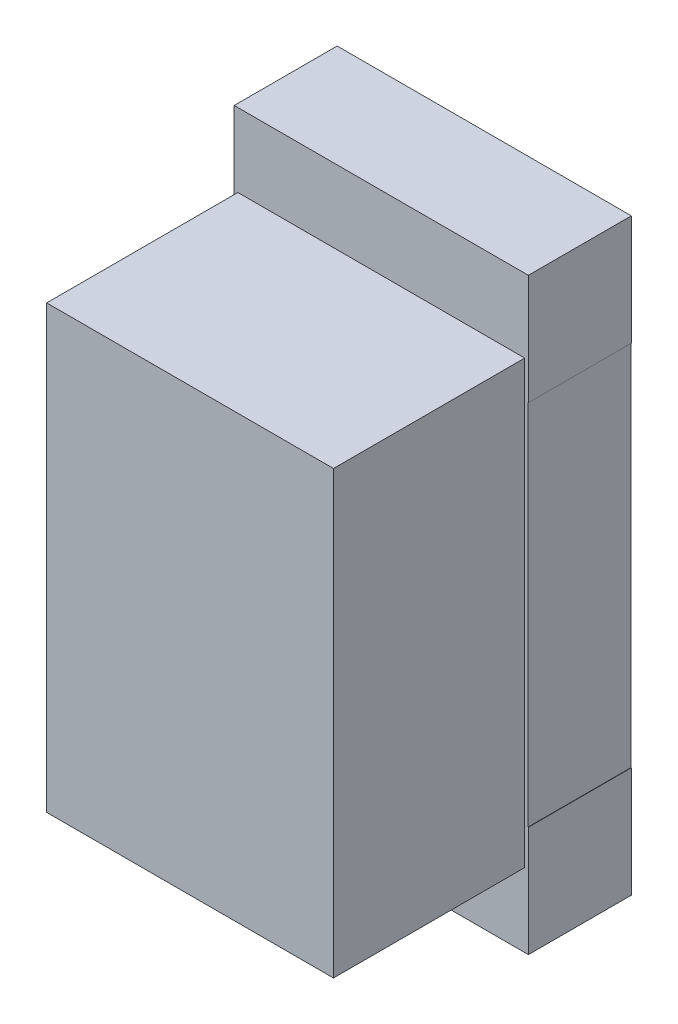
ISO-10303-21;
HEADER;
FILE_DESCRIPTION(('STEP AP214'),'2;1');
FILE_NAME('part.step','',(''),(''),'','','');
FILE_SCHEMA(('AUTOMOTIVE_DESIGN { 1 0 10303 214 1 1 1 1 }'));
ENDSEC;
DATA;
#1=APPLICATION_CONTEXT('core data for automotive mechanical design processes');
#2=APPLICATION_PROTOCOL_DEFINITION('international standard','automotive_design',2000,#1);
#3=PRODUCT_CONTEXT('',#1,'mechanical');
#4=PRODUCT('Part','Part','',(#3));
#5=PRODUCT_RELATED_PRODUCT_CATEGORY('part','',(#4));
#6=PRODUCT_DEFINITION_FORMATION('','',#4);
#7=PRODUCT_DEFINITION_CONTEXT('part definition',#1,'design');
#8=PRODUCT_DEFINITION('design','',#6,#7);
#9=PRODUCT_DEFINITION_SHAPE('','',#8);
#10=(LENGTH_UNIT() NAMED_UNIT(*) SI_UNIT(.MILLI.,.METRE.));
#11=(NAMED_UNIT(*) PLANE_ANGLE_UNIT() SI_UNIT($,.RADIAN.));
#12=(NAMED_UNIT(*) SI_UNIT($,.STERADIAN.) SOLID_ANGLE_UNIT());
#13=UNCERTAINTY_MEASURE_WITH_UNIT(LENGTH_MEASURE(1.E-05),#10,'distance_accuracy_value','');
#14=(GEOMETRIC_REPRESENTATION_CONTEXT(3) GLOBAL_UNCERTAINTY_ASSIGNED_CONTEXT((#13)) GLOBAL_UNIT_ASSIGNED_CONTEXT((#10,
#11,#12)) REPRESENTATION_CONTEXT('',''));
#15=CARTESIAN_POINT('',(0.,0.,0.));
#16=DIRECTION('',(0.,0.,1.));
#17=DIRECTION('',(1.,0.,0.));
#18=AXIS2_PLACEMENT_3D('',#15,#16,#17);
#19=CARTESIAN_POINT('',(0.399,-0.5,1.2800005));
#20=DIRECTION('',(0.,-1.,0.));
#21=DIRECTION('',(-1.,0.,0.));
#22=AXIS2_PLACEMENT_3D('',#19,#20,#21);
#23=PLANE('',#22);
#24=DIRECTION('',(0.,0.,-1.));
#25=VECTOR('',#24,1.);
#26=CARTESIAN_POINT('',(0.4,-0.5,1.2800005));
#27=LINE('',#26,#25);
#28=CARTESIAN_POINT('',(0.4,-0.5,0.28));
#29=VERTEX_POINT('',#28);
#30=CARTESIAN_POINT('',(0.4,-0.5,0.));
#31=VERTEX_POINT('',#30);
#32=EDGE_CURVE('E344',#29,#31,#27,.T.);
#33=ORIENTED_EDGE('',*,*,#32,.T.);
#34=DIRECTION('',(-1.,0.,0.));
#35=VECTOR('',#34,1.);
#36=CARTESIAN_POINT('',(0.399,-0.5,0.));
#37=LINE('',#36,#35);
#38=CARTESIAN_POINT('',(0.399,-0.5,0.));
#39=VERTEX_POINT('',#38);
#40=EDGE_CURVE('E249',#31,#39,#37,.T.);
#41=ORIENTED_EDGE('',*,*,#40,.T.);
#42=DIRECTION('',(0.,0.,-1.));
#43=VECTOR('',#42,1.);
#44=CARTESIAN_POINT('',(0.399,-0.5,1.2800005));
#45=LINE('',#44,#43);
#46=CARTESIAN_POINT('',(0.399,-0.5,0.28));
#47=VERTEX_POINT('',#46);
#48=EDGE_CURVE('E27',#47,#39,#45,.T.);
#49=ORIENTED_EDGE('',*,*,#48,.F.);
#50=DIRECTION('',(-1.,0.,0.));
#51=VECTOR('',#50,1.);
#52=CARTESIAN_POINT('',(0.399,-0.5,0.28));
#53=LINE('',#52,#51);
#54=EDGE_CURVE('E208',#29,#47,#53,.T.);
#55=ORIENTED_EDGE('',*,*,#54,.F.);
#56=EDGE_LOOP('',(#33,#41,#49,#55));
#57=FACE_BOUND('',#56,.T.);
#58=ADVANCED_FACE('F16',(#57),#23,.F.);
#59=CARTESIAN_POINT('',(0.399,0.5,1.2800005));
#60=DIRECTION('',(4.33987020582556E-13,1.,0.));
#61=DIRECTION('',(1.,-4.33987020582556E-13,0.));
#62=AXIS2_PLACEMENT_3D('',#59,#60,#61);
#63=PLANE('',#62);
#64=DIRECTION('',(0.,0.,-1.));
#65=VECTOR('',#64,1.);
#66=CARTESIAN_POINT('',(0.399,0.5,1.2800005));
#67=LINE('',#66,#65);
#68=CARTESIAN_POINT('',(0.399,0.5,0.28));
#69=VERTEX_POINT('',#68);
#70=CARTESIAN_POINT('',(0.399,0.5,0.));
#71=VERTEX_POINT('',#70);
#72=EDGE_CURVE('E11',#69,#71,#67,.T.);
#73=ORIENTED_EDGE('',*,*,#72,.T.);
#74=DIRECTION('',(1.,-4.33987020582556E-13,0.));
#75=VECTOR('',#74,1.);
#76=CARTESIAN_POINT('',(0.399,0.5,0.));
#77=LINE('',#76,#75);
#78=CARTESIAN_POINT('',(0.4,0.5,0.));
#79=VERTEX_POINT('',#78);
#80=EDGE_CURVE('E275',#71,#79,#77,.T.);
#81=ORIENTED_EDGE('',*,*,#80,.T.);
#82=DIRECTION('',(0.,0.,-1.));
#83=VECTOR('',#82,1.);
#84=CARTESIAN_POINT('',(0.4,0.5,1.2800005));
#85=LINE('',#84,#83);
#86=CARTESIAN_POINT('',(0.4,0.5,0.28));
#87=VERTEX_POINT('',#86);
#88=EDGE_CURVE('E218',#87,#79,#85,.T.);
#89=ORIENTED_EDGE('',*,*,#88,.F.);
#90=DIRECTION('',(1.,-4.33987020582556E-13,0.));
#91=VECTOR('',#90,1.);
#92=CARTESIAN_POINT('',(0.399,0.5,0.28));
#93=LINE('',#92,#91);
#94=EDGE_CURVE('E410',#69,#87,#93,.T.);
#95=ORIENTED_EDGE('',*,*,#94,.F.);
#96=EDGE_LOOP('',(#73,#81,#89,#95));
#97=FACE_BOUND('',#96,.T.);
#98=ADVANCED_FACE('F409',(#97),#63,.F.);
#99=CARTESIAN_POINT('',(0.399,0.5,1.2800005));
#100=DIRECTION('',(-1.,0.,0.));
#101=DIRECTION('',(0.,0.,1.));
#102=AXIS2_PLACEMENT_3D('',#99,#100,#101);
#103=PLANE('',#102);
#104=ORIENTED_EDGE('',*,*,#48,.T.);
#105=DIRECTION('',(0.,1.,0.));
#106=VECTOR('',#105,1.);
#107=CARTESIAN_POINT('',(0.399,0.5,0.));
#108=LINE('',#107,#106);
#109=CARTESIAN_POINT('',(0.399,0.,0.));
#110=VERTEX_POINT('',#109);
#111=EDGE_CURVE('E212',#39,#110,#108,.T.);
#112=ORIENTED_EDGE('',*,*,#111,.T.);
#113=DIRECTION('',(0.,1.,0.));
#114=VECTOR('',#113,1.);
#115=CARTESIAN_POINT('',(0.399,0.5,0.));
#116=LINE('',#115,#114);
#117=CARTESIAN_POINT('',(0.399,0.266,0.));
#118=VERTEX_POINT('',#117);
#119=EDGE_CURVE('E432',#110,#118,#116,.T.);
#120=ORIENTED_EDGE('',*,*,#119,.T.);
#121=DIRECTION('',(0.,1.,0.));
#122=VECTOR('',#121,1.);
#123=CARTESIAN_POINT('',(0.399,0.5,0.));
#124=LINE('',#123,#122);
#125=EDGE_CURVE('E303',#118,#71,#124,.T.);
#126=ORIENTED_EDGE('',*,*,#125,.T.);
#127=ORIENTED_EDGE('',*,*,#72,.F.);
#128=DIRECTION('',(0.,1.,0.));
#129=VECTOR('',#128,1.);
#130=CARTESIAN_POINT('',(0.399,0.5,0.28));
#131=LINE('',#130,#129);
#132=EDGE_CURVE('E201',#47,#69,#131,.T.);
#133=ORIENTED_EDGE('',*,*,#132,.F.);
#134=EDGE_LOOP('',(#104,#112,#120,#126,#127,#133));
#135=FACE_BOUND('',#134,.T.);
#136=ADVANCED_FACE('F413',(#135),#103,.F.);
#137=CARTESIAN_POINT('',(-0.4,-0.5,1.2800005));
#138=DIRECTION('',(0.,-1.,0.));
#139=DIRECTION('',(-1.,0.,0.));
#140=AXIS2_PLACEMENT_3D('',#137,#138,#139);
#141=PLANE('',#140);
#142=DIRECTION('',(0.,0.,-1.));
#143=VECTOR('',#142,1.);
#144=CARTESIAN_POINT('',(-0.399,-0.5,1.2800005));
#145=LINE('',#144,#143);
#146=CARTESIAN_POINT('',(-0.399,-0.5,0.28));
#147=VERTEX_POINT('',#146);
#148=CARTESIAN_POINT('',(-0.399,-0.5,0.));
#149=VERTEX_POINT('',#148);
#150=EDGE_CURVE('E230',#147,#149,#145,.T.);
#151=ORIENTED_EDGE('',*,*,#150,.T.);
#152=DIRECTION('',(-1.,0.,0.));
#153=VECTOR('',#152,1.);
#154=CARTESIAN_POINT('',(-0.4,-0.5,0.));
#155=LINE('',#154,#153);
#156=CARTESIAN_POINT('',(-0.4,-0.5,0.));
#157=VERTEX_POINT('',#156);
#158=EDGE_CURVE('E290',#149,#157,#155,.T.);
#159=ORIENTED_EDGE('',*,*,#158,.T.);
#160=DIRECTION('',(0.,0.,-1.));
#161=VECTOR('',#160,1.);
#162=CARTESIAN_POINT('',(-0.4,-0.5,1.2800005));
#163=LINE('',#162,#161);
#164=CARTESIAN_POINT('',(-0.4,-0.5,0.28));
#165=VERTEX_POINT('',#164);
#166=EDGE_CURVE('E254',#165,#157,#163,.T.);
#167=ORIENTED_EDGE('',*,*,#166,.F.);
#168=DIRECTION('',(-1.,0.,0.));
#169=VECTOR('',#168,1.);
#170=CARTESIAN_POINT('',(-0.4,-0.5,0.28));
#171=LINE('',#170,#169);
#172=EDGE_CURVE('E348',#147,#165,#171,.T.);
#173=ORIENTED_EDGE('',*,*,#172,.F.);
#174=EDGE_LOOP('',(#151,#159,#167,#173));
#175=FACE_BOUND('',#174,.T.);
#176=ADVANCED_FACE('F606',(#175),#141,.F.);
#177=CARTESIAN_POINT('',(-0.399,0.5,1.2800005));
#178=DIRECTION('',(1.,0.,0.));
#179=DIRECTION('',(0.,-1.,0.));
#180=AXIS2_PLACEMENT_3D('',#177,#178,#179);
#181=PLANE('',#180);
#182=DIRECTION('',(0.,0.,-1.));
#183=VECTOR('',#182,1.);
#184=CARTESIAN_POINT('',(-0.399,0.5,1.2800005));
#185=LINE('',#184,#183);
#186=CARTESIAN_POINT('',(-0.399,0.5,0.28));
#187=VERTEX_POINT('',#186);
#188=CARTESIAN_POINT('',(-0.399,0.5,0.));
#189=VERTEX_POINT('',#188);
#190=EDGE_CURVE('E234',#187,#189,#185,.T.);
#191=ORIENTED_EDGE('',*,*,#190,.T.);
#192=DIRECTION('',(0.,-1.,0.));
#193=VECTOR('',#192,1.);
#194=CARTESIAN_POINT('',(-0.399,0.5,0.));
#195=LINE('',#194,#193);
#196=CARTESIAN_POINT('',(-0.399,0.266,0.));
#197=VERTEX_POINT('',#196);
#198=EDGE_CURVE('E279',#189,#197,#195,.T.);
#199=ORIENTED_EDGE('',*,*,#198,.T.);
#200=DIRECTION('',(0.,-1.,0.));
#201=VECTOR('',#200,1.);
#202=CARTESIAN_POINT('',(-0.399,0.5,0.));
#203=LINE('',#202,#201);
#204=CARTESIAN_POINT('',(-0.399,0.,0.));
#205=VERTEX_POINT('',#204);
#206=EDGE_CURVE('E343',#197,#205,#203,.T.);
#207=ORIENTED_EDGE('',*,*,#206,.T.);
#208=DIRECTION('',(0.,-1.,0.));
#209=VECTOR('',#208,1.);
#210=CARTESIAN_POINT('',(-0.399,0.5,0.));
#211=LINE('',#210,#209);
#212=EDGE_CURVE('E243',#205,#149,#211,.T.);
#213=ORIENTED_EDGE('',*,*,#212,.T.);
#214=ORIENTED_EDGE('',*,*,#150,.F.);
#215=DIRECTION('',(0.,-1.,0.));
#216=VECTOR('',#215,1.);
#217=CARTESIAN_POINT('',(-0.399,0.5,0.28));
#218=LINE('',#217,#216);
#219=EDGE_CURVE('E436',#187,#147,#218,.T.);
#220=ORIENTED_EDGE('',*,*,#219,.F.);
#221=EDGE_LOOP('',(#191,#199,#207,#213,#214,#220));
#222=FACE_BOUND('',#221,.T.);
#223=ADVANCED_FACE('F370',(#222),#181,.F.);
#224=CARTESIAN_POINT('',(-0.4,0.5,1.2800005));
#225=DIRECTION('',(0.,1.,0.));
#226=DIRECTION('',(1.,0.,0.));
#227=AXIS2_PLACEMENT_3D('',#224,#225,#226);
#228=PLANE('',#227);
#229=DIRECTION('',(0.,0.,-1.));
#230=VECTOR('',#229,1.);
#231=CARTESIAN_POINT('',(-0.4,0.5,1.2800005));
#232=LINE('',#231,#230);
#233=CARTESIAN_POINT('',(-0.4,0.5,0.28));
#234=VERTEX_POINT('',#233);
#235=CARTESIAN_POINT('',(-0.4,0.5,0.));
#236=VERTEX_POINT('',#235);
#237=EDGE_CURVE('E225',#234,#236,#232,.T.);
#238=ORIENTED_EDGE('',*,*,#237,.T.);
#239=DIRECTION('',(1.,0.,0.));
#240=VECTOR('',#239,1.);
#241=CARTESIAN_POINT('',(-0.4,0.5,0.));
#242=LINE('',#241,#240);
#243=EDGE_CURVE('E278',#236,#189,#242,.T.);
#244=ORIENTED_EDGE('',*,*,#243,.T.);
#245=ORIENTED_EDGE('',*,*,#190,.F.);
#246=DIRECTION('',(1.,0.,0.));
#247=VECTOR('',#246,1.);
#248=CARTESIAN_POINT('',(-0.4,0.5,0.28));
#249=LINE('',#248,#247);
#250=EDGE_CURVE('E433',#234,#187,#249,.T.);
#251=ORIENTED_EDGE('',*,*,#250,.F.);
#252=EDGE_LOOP('',(#238,#244,#245,#251));
#253=FACE_BOUND('',#252,.T.);
#254=ADVANCED_FACE('F748',(#253),#228,.F.);
#255=CARTESIAN_POINT('',(0.,0.,0.8));
#256=DIRECTION('',(0.,0.,1.));
#257=DIRECTION('',(1.,0.,0.));
#258=AXIS2_PLACEMENT_3D('',#255,#256,#257);
#259=PLANE('',#258);
#260=DIRECTION('',(0.,-1.,0.));
#261=VECTOR('',#260,1.);
#262=CARTESIAN_POINT('',(-0.39,0.6,0.8));
#263=LINE('',#262,#261);
#264=CARTESIAN_POINT('',(-0.39,0.6,0.8));
#265=VERTEX_POINT('',#264);
#266=CARTESIAN_POINT('',(-0.39,-0.6,0.8));
#267=VERTEX_POINT('',#266);
#268=EDGE_CURVE('E183',#265,#267,#263,.T.);
#269=ORIENTED_EDGE('',*,*,#268,.T.);
#270=DIRECTION('',(1.,0.,0.));
#271=VECTOR('',#270,1.);
#272=CARTESIAN_POINT('',(0.39,-0.6,0.8));
#273=LINE('',#272,#271);
#274=CARTESIAN_POINT('',(0.39,-0.6,0.8));
#275=VERTEX_POINT('',#274);
#276=EDGE_CURVE('E116',#267,#275,#273,.T.);
#277=ORIENTED_EDGE('',*,*,#276,.T.);
#278=DIRECTION('',(0.,1.,0.));
#279=VECTOR('',#278,1.);
#280=CARTESIAN_POINT('',(0.39,-0.6,0.8));
#281=LINE('',#280,#279);
#282=CARTESIAN_POINT('',(0.39,0.6,0.8));
#283=VERTEX_POINT('',#282);
#284=EDGE_CURVE('E235',#275,#283,#281,.T.);
#285=ORIENTED_EDGE('',*,*,#284,.T.);
#286=DIRECTION('',(-1.,0.,0.));
#287=VECTOR('',#286,1.);
#288=CARTESIAN_POINT('',(-0.39,0.6,0.8));
#289=LINE('',#288,#287);
#290=EDGE_CURVE('E20',#283,#265,#289,.T.);
#291=ORIENTED_EDGE('',*,*,#290,.T.);
#292=EDGE_LOOP('',(#269,#277,#285,#291));
#293=FACE_BOUND('',#292,.T.);
#294=ADVANCED_FACE('F753',(#293),#259,.T.);
#295=CARTESIAN_POINT('',(-0.39,0.6,0.8));
#296=DIRECTION('',(0.,-1.,0.));
#297=DIRECTION('',(-1.,0.,0.));
#298=AXIS2_PLACEMENT_3D('',#295,#296,#297);
#299=PLANE('',#298);
#300=DIRECTION('',(-1.,0.,0.));
#301=VECTOR('',#300,1.);
#302=CARTESIAN_POINT('',(-0.39,0.6,0.28));
#303=LINE('',#302,#301);
#304=CARTESIAN_POINT('',(0.39,0.6,0.28));
#305=VERTEX_POINT('',#304);
#306=CARTESIAN_POINT('',(-0.39,0.6,0.28));
#307=VERTEX_POINT('',#306);
#308=EDGE_CURVE('E187',#305,#307,#303,.T.);
#309=ORIENTED_EDGE('',*,*,#308,.T.);
#310=DIRECTION('',(0.,0.,-1.));
#311=VECTOR('',#310,1.);
#312=CARTESIAN_POINT('',(-0.39,0.6,0.8));
#313=LINE('',#312,#311);
#314=EDGE_CURVE('E177',#265,#307,#313,.T.);
#315=ORIENTED_EDGE('',*,*,#314,.F.);
#316=ORIENTED_EDGE('',*,*,#290,.F.);
#317=DIRECTION('',(0.,0.,-1.));
#318=VECTOR('',#317,1.);
#319=CARTESIAN_POINT('',(0.39,0.6,0.8));
#320=LINE('',#319,#318);
#321=EDGE_CURVE('E190',#283,#305,#320,.T.);
#322=ORIENTED_EDGE('',*,*,#321,.T.);
#323=EDGE_LOOP('',(#309,#315,#316,#322));
#324=FACE_BOUND('',#323,.T.);
#325=ADVANCED_FACE('F188',(#324),#299,.F.);
#326=CARTESIAN_POINT('',(0.39,-0.6,0.8));
#327=DIRECTION('',(-1.,0.,0.));
#328=DIRECTION('',(0.,0.,1.));
#329=AXIS2_PLACEMENT_3D('',#326,#327,#328);
#330=PLANE('',#329);
#331=DIRECTION('',(0.,1.,0.));
#332=VECTOR('',#331,1.);
#333=CARTESIAN_POINT('',(0.39,-0.6,0.28));
#334=LINE('',#333,#332);
#335=CARTESIAN_POINT('',(0.39,-0.6,0.28));
#336=VERTEX_POINT('',#335);
#337=EDGE_CURVE('E194',#336,#305,#334,.T.);
#338=ORIENTED_EDGE('',*,*,#337,.T.);
#339=ORIENTED_EDGE('',*,*,#321,.F.);
#340=ORIENTED_EDGE('',*,*,#284,.F.);
#341=DIRECTION('',(0.,0.,-1.));
#342=VECTOR('',#341,1.);
#343=CARTESIAN_POINT('',(0.39,-0.6,0.8));
#344=LINE('',#343,#342);
#345=EDGE_CURVE('E126',#275,#336,#344,.T.);
#346=ORIENTED_EDGE('',*,*,#345,.T.);
#347=EDGE_LOOP('',(#338,#339,#340,#346));
#348=FACE_BOUND('',#347,.T.);
#349=ADVANCED_FACE('F18',(#348),#330,.F.);
#350=CARTESIAN_POINT('',(0.39,-0.6,0.8));
#351=DIRECTION('',(0.,1.,0.));
#352=DIRECTION('',(1.,0.,0.));
#353=AXIS2_PLACEMENT_3D('',#350,#351,#352);
#354=PLANE('',#353);
#355=DIRECTION('',(1.,0.,0.));
#356=VECTOR('',#355,1.);
#357=CARTESIAN_POINT('',(0.39,-0.6,0.28));
#358=LINE('',#357,#356);
#359=CARTESIAN_POINT('',(-0.39,-0.6,0.28));
#360=VERTEX_POINT('',#359);
#361=EDGE_CURVE('E199',#360,#336,#358,.T.);
#362=ORIENTED_EDGE('',*,*,#361,.T.);
#363=ORIENTED_EDGE('',*,*,#345,.F.);
#364=ORIENTED_EDGE('',*,*,#276,.F.);
#365=DIRECTION('',(0.,0.,-1.));
#366=VECTOR('',#365,1.);
#367=CARTESIAN_POINT('',(-0.39,-0.6,0.8));
#368=LINE('',#367,#366);
#369=EDGE_CURVE('E262',#267,#360,#368,.T.);
#370=ORIENTED_EDGE('',*,*,#369,.T.);
#371=EDGE_LOOP('',(#362,#363,#364,#370));
#372=FACE_BOUND('',#371,.T.);
#373=ADVANCED_FACE('F629',(#372),#354,.F.);
#374=CARTESIAN_POINT('',(-0.39,0.6,0.8));
#375=DIRECTION('',(1.,0.,0.));
#376=DIRECTION('',(0.,0.,1.));
#377=AXIS2_PLACEMENT_3D('',#374,#375,#376);
#378=PLANE('',#377);
#379=DIRECTION('',(0.,-1.,0.));
#380=VECTOR('',#379,1.);
#381=CARTESIAN_POINT('',(-0.39,0.6,0.28));
#382=LINE('',#381,#380);
#383=EDGE_CURVE('E182',#307,#360,#382,.T.);
#384=ORIENTED_EDGE('',*,*,#383,.T.);
#385=ORIENTED_EDGE('',*,*,#369,.F.);
#386=ORIENTED_EDGE('',*,*,#268,.F.);
#387=ORIENTED_EDGE('',*,*,#314,.T.);
#388=EDGE_LOOP('',(#384,#385,#386,#387));
#389=FACE_BOUND('',#388,.T.);
#390=ADVANCED_FACE('F179',(#389),#378,.F.);
#391=CARTESIAN_POINT('',(0.,0.,0.28));
#392=DIRECTION('',(0.,0.,1.));
#393=DIRECTION('',(1.,0.,0.));
#394=AXIS2_PLACEMENT_3D('',#391,#392,#393);
#395=PLANE('',#394);
#396=ORIENTED_EDGE('',*,*,#383,.F.);
#397=ORIENTED_EDGE('',*,*,#308,.F.);
#398=ORIENTED_EDGE('',*,*,#337,.F.);
#399=ORIENTED_EDGE('',*,*,#361,.F.);
#400=EDGE_LOOP('',(#396,#397,#398,#399));
#401=FACE_BOUND('',#400,.T.);
#402=ORIENTED_EDGE('',*,*,#94,.T.);
#403=DIRECTION('',(0.,1.,0.));
#404=VECTOR('',#403,1.);
#405=CARTESIAN_POINT('',(0.4,-0.8,0.28));
#406=LINE('',#405,#404);
#407=CARTESIAN_POINT('',(0.4,0.8,0.28));
#408=VERTEX_POINT('',#407);
#409=EDGE_CURVE('E214',#87,#408,#406,.T.);
#410=ORIENTED_EDGE('',*,*,#409,.T.);
#411=DIRECTION('',(-1.,0.,0.));
#412=VECTOR('',#411,1.);
#413=CARTESIAN_POINT('',(0.4,0.8,0.28));
#414=LINE('',#413,#412);
#415=CARTESIAN_POINT('',(-0.4,0.8,0.28));
#416=VERTEX_POINT('',#415);
#417=EDGE_CURVE('E226',#408,#416,#414,.T.);
#418=ORIENTED_EDGE('',*,*,#417,.T.);
#419=DIRECTION('',(0.,-1.,0.));
#420=VECTOR('',#419,1.);
#421=CARTESIAN_POINT('',(-0.4,0.8,0.28));
#422=LINE('',#421,#420);
#423=EDGE_CURVE('E220',#416,#234,#422,.T.);
#424=ORIENTED_EDGE('',*,*,#423,.T.);
#425=ORIENTED_EDGE('',*,*,#250,.T.);
#426=ORIENTED_EDGE('',*,*,#219,.T.);
#427=ORIENTED_EDGE('',*,*,#172,.T.);
#428=DIRECTION('',(0.,-1.,0.));
#429=VECTOR('',#428,1.);
#430=CARTESIAN_POINT('',(-0.4,0.8,0.28));
#431=LINE('',#430,#429);
#432=CARTESIAN_POINT('',(-0.4,-0.8,0.28));
#433=VERTEX_POINT('',#432);
#434=EDGE_CURVE('E229',#165,#433,#431,.T.);
#435=ORIENTED_EDGE('',*,*,#434,.T.);
#436=DIRECTION('',(1.,0.,0.));
#437=VECTOR('',#436,1.);
#438=CARTESIAN_POINT('',(-0.4,-0.8,0.28));
#439=LINE('',#438,#437);
#440=CARTESIAN_POINT('',(0.4,-0.8,0.28));
#441=VERTEX_POINT('',#440);
#442=EDGE_CURVE('E253',#433,#441,#439,.T.);
#443=ORIENTED_EDGE('',*,*,#442,.T.);
#444=DIRECTION('',(0.,1.,0.));
#445=VECTOR('',#444,1.);
#446=CARTESIAN_POINT('',(0.4,-0.8,0.28));
#447=LINE('',#446,#445);
#448=EDGE_CURVE('E339',#441,#29,#447,.T.);
#449=ORIENTED_EDGE('',*,*,#448,.T.);
#450=ORIENTED_EDGE('',*,*,#54,.T.);
#451=ORIENTED_EDGE('',*,*,#132,.T.);
#452=EDGE_LOOP('',(#402,#410,#418,#424,#425,#426,#427,#435,#443,#449,#450,#451));
#453=FACE_BOUND('',#452,.T.);
#454=ADVANCED_FACE('F197',(#401,#453),#395,.T.);
#455=CARTESIAN_POINT('',(0.,0.,0.));
#456=DIRECTION('',(0.,0.,1.));
#457=DIRECTION('',(1.,0.,0.));
#458=AXIS2_PLACEMENT_3D('',#455,#456,#457);
#459=PLANE('',#458);
#460=ORIENTED_EDGE('',*,*,#206,.F.);
#461=DIRECTION('',(1.,0.,0.));
#462=VECTOR('',#461,1.);
#463=CARTESIAN_POINT('',(0.,0.266,0.));
#464=LINE('',#463,#462);
#465=EDGE_CURVE('E299',#197,#118,#464,.T.);
#466=ORIENTED_EDGE('',*,*,#465,.T.);
#467=ORIENTED_EDGE('',*,*,#119,.F.);
#468=DIRECTION('',(-1.,0.,0.));
#469=VECTOR('',#468,1.);
#470=CARTESIAN_POINT('',(0.,0.,0.));
#471=LINE('',#470,#469);
#472=CARTESIAN_POINT('',(0.133,0.,0.));
#473=VERTEX_POINT('',#472);
#474=EDGE_CURVE('E312',#110,#473,#471,.T.);
#475=ORIENTED_EDGE('',*,*,#474,.T.);
#476=DIRECTION('',(0.,-1.,0.));
#477=VECTOR('',#476,1.);
#478=CARTESIAN_POINT('',(0.133,0.,0.));
#479=LINE('',#478,#477);
#480=CARTESIAN_POINT('',(0.133,-0.266,0.));
#481=VERTEX_POINT('',#480);
#482=EDGE_CURVE('E308',#473,#481,#479,.T.);
#483=ORIENTED_EDGE('',*,*,#482,.T.);
#484=DIRECTION('',(-1.,0.,0.));
#485=VECTOR('',#484,1.);
#486=CARTESIAN_POINT('',(0.,-0.266,0.));
#487=LINE('',#486,#485);
#488=CARTESIAN_POINT('',(-0.133,-0.266,0.));
#489=VERTEX_POINT('',#488);
#490=EDGE_CURVE('E313',#481,#489,#487,.T.);
#491=ORIENTED_EDGE('',*,*,#490,.T.);
#492=DIRECTION('',(0.,1.,0.));
#493=VECTOR('',#492,1.);
#494=CARTESIAN_POINT('',(-0.133,0.,0.));
#495=LINE('',#494,#493);
#496=CARTESIAN_POINT('',(-0.133,0.,0.));
#497=VERTEX_POINT('',#496);
#498=EDGE_CURVE('E242',#489,#497,#495,.T.);
#499=ORIENTED_EDGE('',*,*,#498,.T.);
#500=DIRECTION('',(-1.,0.,0.));
#501=VECTOR('',#500,1.);
#502=CARTESIAN_POINT('',(0.,0.,0.));
#503=LINE('',#502,#501);
#504=EDGE_CURVE('E238',#497,#205,#503,.T.);
#505=ORIENTED_EDGE('',*,*,#504,.T.);
#506=EDGE_LOOP('',(#460,#466,#467,#475,#483,#491,#499,#505));
#507=FACE_BOUND('',#506,.T.);
#508=ADVANCED_FACE('F356',(#507),#459,.F.);
#509=CARTESIAN_POINT('',(0.4,-0.8,0.8));
#510=DIRECTION('',(-1.,0.,0.));
#511=DIRECTION('',(0.,0.,1.));
#512=AXIS2_PLACEMENT_3D('',#509,#510,#511);
#513=PLANE('',#512);
#514=DIRECTION('',(0.,1.,0.));
#515=VECTOR('',#514,1.);
#516=CARTESIAN_POINT('',(0.4,-0.8,0.));
#517=LINE('',#516,#515);
#518=CARTESIAN_POINT('',(0.4,-0.8,0.));
#519=VERTEX_POINT('',#518);
#520=EDGE_CURVE('E244',#519,#31,#517,.T.);
#521=ORIENTED_EDGE('',*,*,#520,.T.);
#522=ORIENTED_EDGE('',*,*,#32,.F.);
#523=ORIENTED_EDGE('',*,*,#448,.F.);
#524=DIRECTION('',(0.,0.,-1.));
#525=VECTOR('',#524,1.);
#526=CARTESIAN_POINT('',(0.4,-0.8,0.8));
#527=LINE('',#526,#525);
#528=EDGE_CURVE('E274',#441,#519,#527,.T.);
#529=ORIENTED_EDGE('',*,*,#528,.T.);
#530=EDGE_LOOP('',(#521,#522,#523,#529));
#531=FACE_BOUND('',#530,.T.);
#532=ADVANCED_FACE('F672',(#531),#513,.F.);
#533=CARTESIAN_POINT('',(-0.4,-0.8,0.8));
#534=DIRECTION('',(0.,1.,0.));
#535=DIRECTION('',(1.,0.,0.));
#536=AXIS2_PLACEMENT_3D('',#533,#534,#535);
#537=PLANE('',#536);
#538=ORIENTED_EDGE('',*,*,#442,.F.);
#539=DIRECTION('',(0.,0.,-1.));
#540=VECTOR('',#539,1.);
#541=CARTESIAN_POINT('',(-0.4,-0.8,0.8));
#542=LINE('',#541,#540);
#543=CARTESIAN_POINT('',(-0.4,-0.8,0.));
#544=VERTEX_POINT('',#543);
#545=EDGE_CURVE('E250',#433,#544,#542,.T.);
#546=ORIENTED_EDGE('',*,*,#545,.T.);
#547=DIRECTION('',(1.,0.,0.));
#548=VECTOR('',#547,1.);
#549=CARTESIAN_POINT('',(-0.4,-0.8,0.));
#550=LINE('',#549,#548);
#551=EDGE_CURVE('E248',#544,#519,#550,.T.);
#552=ORIENTED_EDGE('',*,*,#551,.T.);
#553=ORIENTED_EDGE('',*,*,#528,.F.);
#554=EDGE_LOOP('',(#538,#546,#552,#553));
#555=FACE_BOUND('',#554,.T.);
#556=ADVANCED_FACE('F613',(#555),#537,.F.);
#557=CARTESIAN_POINT('',(-0.4,-0.8,0.8));
#558=DIRECTION('',(1.,0.,0.));
#559=DIRECTION('',(0.,-1.,0.));
#560=AXIS2_PLACEMENT_3D('',#557,#558,#559);
#561=PLANE('',#560);
#562=ORIENTED_EDGE('',*,*,#434,.F.);
#563=ORIENTED_EDGE('',*,*,#166,.T.);
#564=DIRECTION('',(0.,-1.,0.));
#565=VECTOR('',#564,1.);
#566=CARTESIAN_POINT('',(-0.4,-0.8,0.));
#567=LINE('',#566,#565);
#568=EDGE_CURVE('E219',#157,#544,#567,.T.);
#569=ORIENTED_EDGE('',*,*,#568,.T.);
#570=ORIENTED_EDGE('',*,*,#545,.F.);
#571=EDGE_LOOP('',(#562,#563,#569,#570));
#572=FACE_BOUND('',#571,.T.);
#573=ADVANCED_FACE('F610',(#572),#561,.F.);
#574=CARTESIAN_POINT('',(-0.4,0.8,0.8));
#575=DIRECTION('',(0.,-1.,0.));
#576=DIRECTION('',(-1.,0.,0.));
#577=AXIS2_PLACEMENT_3D('',#574,#575,#576);
#578=PLANE('',#577);
#579=ORIENTED_EDGE('',*,*,#417,.F.);
#580=DIRECTION('',(0.,0.,-1.));
#581=VECTOR('',#580,1.);
#582=CARTESIAN_POINT('',(0.4,0.8,0.8));
#583=LINE('',#582,#581);
#584=CARTESIAN_POINT('',(0.4,0.8,0.));
#585=VERTEX_POINT('',#584);
#586=EDGE_CURVE('E286',#408,#585,#583,.T.);
#587=ORIENTED_EDGE('',*,*,#586,.T.);
#588=DIRECTION('',(-1.,0.,0.));
#589=VECTOR('',#588,1.);
#590=CARTESIAN_POINT('',(-0.4,0.8,0.));
#591=LINE('',#590,#589);
#592=CARTESIAN_POINT('',(-0.4,0.8,0.));
#593=VERTEX_POINT('',#592);
#594=EDGE_CURVE('E291',#585,#593,#591,.T.);
#595=ORIENTED_EDGE('',*,*,#594,.T.);
#596=DIRECTION('',(0.,0.,-1.));
#597=VECTOR('',#596,1.);
#598=CARTESIAN_POINT('',(-0.4,0.8,0.8));
#599=LINE('',#598,#597);
#600=EDGE_CURVE('E224',#416,#593,#599,.T.);
#601=ORIENTED_EDGE('',*,*,#600,.F.);
#602=EDGE_LOOP('',(#579,#587,#595,#601));
#603=FACE_BOUND('',#602,.T.);
#604=ADVANCED_FACE('F697',(#603),#578,.F.);
#605=CARTESIAN_POINT('',(-0.4,-0.8,0.8));
#606=DIRECTION('',(1.,0.,0.));
#607=DIRECTION('',(0.,-1.,0.));
#608=AXIS2_PLACEMENT_3D('',#605,#606,#607);
#609=PLANE('',#608);
#610=DIRECTION('',(0.,-1.,0.));
#611=VECTOR('',#610,1.);
#612=CARTESIAN_POINT('',(-0.4,-0.8,0.));
#613=LINE('',#612,#611);
#614=EDGE_CURVE('E330',#593,#236,#613,.T.);
#615=ORIENTED_EDGE('',*,*,#614,.T.);
#616=ORIENTED_EDGE('',*,*,#237,.F.);
#617=ORIENTED_EDGE('',*,*,#423,.F.);
#618=ORIENTED_EDGE('',*,*,#600,.T.);
#619=EDGE_LOOP('',(#615,#616,#617,#618));
#620=FACE_BOUND('',#619,.T.);
#621=ADVANCED_FACE('F654',(#620),#609,.F.);
#622=CARTESIAN_POINT('',(0.4,-0.8,0.8));
#623=DIRECTION('',(-1.,0.,0.));
#624=DIRECTION('',(0.,0.,1.));
#625=AXIS2_PLACEMENT_3D('',#622,#623,#624);
#626=PLANE('',#625);
#627=ORIENTED_EDGE('',*,*,#409,.F.);
#628=ORIENTED_EDGE('',*,*,#88,.T.);
#629=DIRECTION('',(0.,1.,0.));
#630=VECTOR('',#629,1.);
#631=CARTESIAN_POINT('',(0.4,-0.8,0.));
#632=LINE('',#631,#630);
#633=EDGE_CURVE('E287',#79,#585,#632,.T.);
#634=ORIENTED_EDGE('',*,*,#633,.T.);
#635=ORIENTED_EDGE('',*,*,#586,.F.);
#636=EDGE_LOOP('',(#627,#628,#634,#635));
#637=FACE_BOUND('',#636,.T.);
#638=ADVANCED_FACE('F397',(#637),#626,.F.);
#639=CARTESIAN_POINT('',(0.,0.,0.));
#640=DIRECTION('',(0.,0.,1.));
#641=DIRECTION('',(1.,0.,0.));
#642=AXIS2_PLACEMENT_3D('',#639,#640,#641);
#643=PLANE('',#642);
#644=ORIENTED_EDGE('',*,*,#158,.F.);
#645=DIRECTION('',(1.,0.,0.));
#646=VECTOR('',#645,1.);
#647=CARTESIAN_POINT('',(0.,-0.5,0.));
#648=LINE('',#647,#646);
#649=EDGE_CURVE('E255',#149,#39,#648,.T.);
#650=ORIENTED_EDGE('',*,*,#649,.T.);
#651=ORIENTED_EDGE('',*,*,#40,.F.);
#652=ORIENTED_EDGE('',*,*,#520,.F.);
#653=ORIENTED_EDGE('',*,*,#551,.F.);
#654=ORIENTED_EDGE('',*,*,#568,.F.);
#655=EDGE_LOOP('',(#644,#650,#651,#652,#653,#654));
#656=FACE_BOUND('',#655,.T.);
#657=ADVANCED_FACE('F653',(#656),#643,.F.);
#658=CARTESIAN_POINT('',(0.,0.,0.));
#659=DIRECTION('',(0.,0.,1.));
#660=DIRECTION('',(1.,0.,0.));
#661=AXIS2_PLACEMENT_3D('',#658,#659,#660);
#662=PLANE('',#661);
#663=ORIENTED_EDGE('',*,*,#80,.F.);
#664=DIRECTION('',(-1.,0.,0.));
#665=VECTOR('',#664,1.);
#666=CARTESIAN_POINT('',(0.,0.5,0.));
#667=LINE('',#666,#665);
#668=EDGE_CURVE('E307',#71,#189,#667,.T.);
#669=ORIENTED_EDGE('',*,*,#668,.T.);
#670=ORIENTED_EDGE('',*,*,#243,.F.);
#671=ORIENTED_EDGE('',*,*,#614,.F.);
#672=ORIENTED_EDGE('',*,*,#594,.F.);
#673=ORIENTED_EDGE('',*,*,#633,.F.);
#674=EDGE_LOOP('',(#663,#669,#670,#671,#672,#673));
#675=FACE_BOUND('',#674,.T.);
#676=ADVANCED_FACE('F406',(#675),#662,.F.);
#677=CARTESIAN_POINT('',(0.,0.,0.));
#678=DIRECTION('',(0.,0.,1.));
#679=DIRECTION('',(1.,0.,0.));
#680=AXIS2_PLACEMENT_3D('',#677,#678,#679);
#681=PLANE('',#680);
#682=ORIENTED_EDGE('',*,*,#668,.F.);
#683=ORIENTED_EDGE('',*,*,#125,.F.);
#684=ORIENTED_EDGE('',*,*,#465,.F.);
#685=ORIENTED_EDGE('',*,*,#198,.F.);
#686=EDGE_LOOP('',(#682,#683,#684,#685));
#687=FACE_BOUND('',#686,.T.);
#688=ADVANCED_FACE('F642',(#687),#681,.F.);
#689=CARTESIAN_POINT('',(0.,0.,0.));
#690=DIRECTION('',(0.,0.,1.));
#691=DIRECTION('',(1.,0.,0.));
#692=AXIS2_PLACEMENT_3D('',#689,#690,#691);
#693=PLANE('',#692);
#694=ORIENTED_EDGE('',*,*,#649,.F.);
#695=ORIENTED_EDGE('',*,*,#212,.F.);
#696=ORIENTED_EDGE('',*,*,#504,.F.);
#697=ORIENTED_EDGE('',*,*,#498,.F.);
#698=ORIENTED_EDGE('',*,*,#490,.F.);
#699=ORIENTED_EDGE('',*,*,#482,.F.);
#700=ORIENTED_EDGE('',*,*,#474,.F.);
#701=ORIENTED_EDGE('',*,*,#111,.F.);
#702=EDGE_LOOP('',(#694,#695,#696,#697,#698,#699,#700,#701));
#703=FACE_BOUND('',#702,.T.);
#704=ADVANCED_FACE('F361',(#703),#693,.F.);
#705=CLOSED_SHELL('',(#58,#98,#136,#176,#223,#254,#294,#325,#349,#373,#390,#454,#508,#532,#556,
#573,#604,#621,#638,#657,#676,#688,#704));
#706=MANIFOLD_SOLID_BREP('B1',#705);
#707=ADVANCED_BREP_SHAPE_REPRESENTATION('',(#18,#706),#14);
#708=SHAPE_DEFINITION_REPRESENTATION(#9,#707);
ENDSEC;
END-ISO-10303-21;
